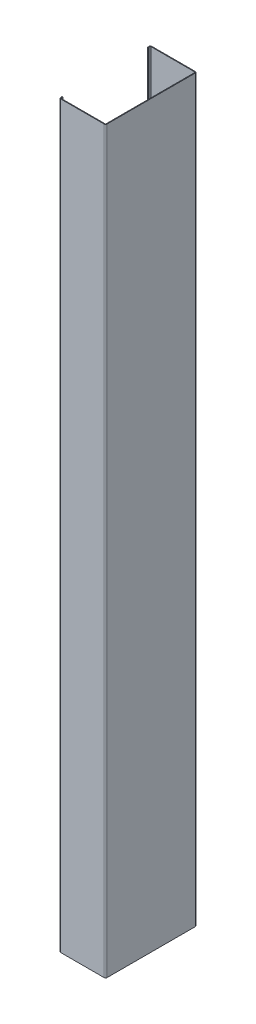
ISO-10303-21;
HEADER;
FILE_DESCRIPTION(('STEP AP214'),'2;1');
FILE_NAME('part.step','',(''),(''),'','','');
FILE_SCHEMA(('AUTOMOTIVE_DESIGN { 1 0 10303 214 1 1 1 1 }'));
ENDSEC;
DATA;
#1=APPLICATION_CONTEXT('core data for automotive mechanical design processes');
#2=APPLICATION_PROTOCOL_DEFINITION('international standard','automotive_design',2000,#1);
#3=PRODUCT_CONTEXT('',#1,'mechanical');
#4=PRODUCT('Part','Part','',(#3));
#5=PRODUCT_RELATED_PRODUCT_CATEGORY('part','',(#4));
#6=PRODUCT_DEFINITION_FORMATION('','',#4);
#7=PRODUCT_DEFINITION_CONTEXT('part definition',#1,'design');
#8=PRODUCT_DEFINITION('design','',#6,#7);
#9=PRODUCT_DEFINITION_SHAPE('','',#8);
#10=(LENGTH_UNIT() NAMED_UNIT(*) SI_UNIT(.MILLI.,.METRE.));
#11=(NAMED_UNIT(*) PLANE_ANGLE_UNIT() SI_UNIT($,.RADIAN.));
#12=(NAMED_UNIT(*) SI_UNIT($,.STERADIAN.) SOLID_ANGLE_UNIT());
#13=UNCERTAINTY_MEASURE_WITH_UNIT(LENGTH_MEASURE(1.E-05),#10,'distance_accuracy_value','');
#14=(GEOMETRIC_REPRESENTATION_CONTEXT(3) GLOBAL_UNCERTAINTY_ASSIGNED_CONTEXT((#13)) GLOBAL_UNIT_ASSIGNED_CONTEXT((#10,
#11,#12)) REPRESENTATION_CONTEXT('',''));
#15=CARTESIAN_POINT('',(0.,0.,0.));
#16=DIRECTION('',(0.,0.,1.));
#17=DIRECTION('',(1.,0.,0.));
#18=AXIS2_PLACEMENT_3D('',#15,#16,#17);
#19=CARTESIAN_POINT('',(-50.,3000.,-49.25));
#20=DIRECTION('',(1.,0.,0.));
#21=DIRECTION('',(0.,0.,-1.));
#22=AXIS2_PLACEMENT_3D('',#19,#20,#21);
#23=PLANE('',#22);
#24=DIRECTION('',(0.,0.,1.));
#25=VECTOR('',#24,1.);
#26=CARTESIAN_POINT('',(-50.,2200.75,-49.25));
#27=LINE('',#26,#25);
#28=CARTESIAN_POINT('',(-50.,2200.75,-47.75));
#29=VERTEX_POINT('',#28);
#30=CARTESIAN_POINT('',(-50.,2200.75,-46.25));
#31=VERTEX_POINT('',#30);
#32=EDGE_CURVE('E51',#29,#31,#27,.T.);
#33=ORIENTED_EDGE('',*,*,#32,.T.);
#34=DIRECTION('',(0.,-1.,0.));
#35=VECTOR('',#34,1.);
#36=CARTESIAN_POINT('',(-50.,3000.,-46.25));
#37=LINE('',#36,#35);
#38=CARTESIAN_POINT('',(-50.,3000.,-46.25));
#39=VERTEX_POINT('',#38);
#40=EDGE_CURVE('E45',#39,#31,#37,.T.);
#41=ORIENTED_EDGE('',*,*,#40,.F.);
#42=DIRECTION('',(0.,0.,1.));
#43=VECTOR('',#42,1.);
#44=CARTESIAN_POINT('',(-50.,3000.,-49.25));
#45=LINE('',#44,#43);
#46=CARTESIAN_POINT('',(-50.,3000.,-47.75));
#47=VERTEX_POINT('',#46);
#48=EDGE_CURVE('E178',#47,#39,#45,.T.);
#49=ORIENTED_EDGE('',*,*,#48,.F.);
#50=DIRECTION('',(0.,-1.,0.));
#51=VECTOR('',#50,1.);
#52=CARTESIAN_POINT('',(-50.,3000.,-47.75));
#53=LINE('',#52,#51);
#54=EDGE_CURVE('E185',#47,#29,#53,.T.);
#55=ORIENTED_EDGE('',*,*,#54,.T.);
#56=EDGE_LOOP('',(#33,#41,#49,#55));
#57=FACE_BOUND('',#56,.T.);
#58=ADVANCED_FACE('F38',(#57),#23,.F.);
#59=CARTESIAN_POINT('',(-49.25,3000.,-46.25));
#60=DIRECTION('',(0.,0.,1.));
#61=DIRECTION('',(1.,0.,0.));
#62=AXIS2_PLACEMENT_3D('',#59,#60,#61);
#63=PLANE('',#62);
#64=ORIENTED_EDGE('',*,*,#40,.T.);
#65=DIRECTION('',(1.,0.,0.));
#66=VECTOR('',#65,1.);
#67=CARTESIAN_POINT('',(-49.25,2200.75,-46.25));
#68=LINE('',#67,#66);
#69=CARTESIAN_POINT('',(-49.25,2200.75,-46.25));
#70=VERTEX_POINT('',#69);
#71=EDGE_CURVE('E171',#31,#70,#68,.T.);
#72=ORIENTED_EDGE('',*,*,#71,.T.);
#73=DIRECTION('',(0.,-1.,0.));
#74=VECTOR('',#73,1.);
#75=CARTESIAN_POINT('',(-49.25,3000.,-46.25));
#76=LINE('',#75,#74);
#77=CARTESIAN_POINT('',(-49.25,3000.,-46.25));
#78=VERTEX_POINT('',#77);
#79=EDGE_CURVE('E192',#78,#70,#76,.T.);
#80=ORIENTED_EDGE('',*,*,#79,.F.);
#81=DIRECTION('',(-1.,0.,0.));
#82=VECTOR('',#81,1.);
#83=CARTESIAN_POINT('',(-49.25,3000.,-46.25));
#84=LINE('',#83,#82);
#85=EDGE_CURVE('E191',#78,#39,#84,.T.);
#86=ORIENTED_EDGE('',*,*,#85,.T.);
#87=EDGE_LOOP('',(#64,#72,#80,#86));
#88=FACE_BOUND('',#87,.T.);
#89=ADVANCED_FACE('F189',(#88),#63,.T.);
#90=CARTESIAN_POINT('',(-49.25,3000.,-49.25));
#91=DIRECTION('',(1.,0.,0.));
#92=DIRECTION('',(0.,0.,-1.));
#93=AXIS2_PLACEMENT_3D('',#90,#91,#92);
#94=PLANE('',#93);
#95=ORIENTED_EDGE('',*,*,#79,.T.);
#96=DIRECTION('',(0.,0.,-1.));
#97=VECTOR('',#96,1.);
#98=CARTESIAN_POINT('',(-49.25,2200.75,-49.25));
#99=LINE('',#98,#97);
#100=CARTESIAN_POINT('',(-49.25,2200.75,-47.75));
#101=VERTEX_POINT('',#100);
#102=EDGE_CURVE('E174',#70,#101,#99,.T.);
#103=ORIENTED_EDGE('',*,*,#102,.T.);
#104=DIRECTION('',(0.,-1.,0.));
#105=VECTOR('',#104,1.);
#106=CARTESIAN_POINT('',(-49.25,3000.,-47.75));
#107=LINE('',#106,#105);
#108=CARTESIAN_POINT('',(-49.25,3000.,-47.75));
#109=VERTEX_POINT('',#108);
#110=EDGE_CURVE('E193',#109,#101,#107,.T.);
#111=ORIENTED_EDGE('',*,*,#110,.F.);
#112=DIRECTION('',(0.,0.,-1.));
#113=VECTOR('',#112,1.);
#114=CARTESIAN_POINT('',(-49.25,3000.,-49.25));
#115=LINE('',#114,#113);
#116=EDGE_CURVE('E289',#109,#78,#115,.F.);
#117=ORIENTED_EDGE('',*,*,#116,.T.);
#118=EDGE_LOOP('',(#95,#103,#111,#117));
#119=FACE_BOUND('',#118,.T.);
#120=ADVANCED_FACE('F397',(#119),#94,.T.);
#121=CARTESIAN_POINT('',(-48.5,3000.,-47.75));
#122=DIRECTION('',(0.,-1.,0.));
#123=DIRECTION('',(0.,0.,-1.));
#124=AXIS2_PLACEMENT_3D('',#121,#122,#123);
#125=CYLINDRICAL_SURFACE('',#124,0.75);
#126=ORIENTED_EDGE('',*,*,#110,.T.);
#127=CARTESIAN_POINT('',(-48.5,2200.75,-47.75));
#128=DIRECTION('',(0.,-1.,0.));
#129=DIRECTION('',(0.,0.,-1.));
#130=AXIS2_PLACEMENT_3D('',#127,#128,#129);
#131=CIRCLE('',#130,0.75);
#132=CARTESIAN_POINT('',(-48.5,2200.75,-48.5));
#133=VERTEX_POINT('',#132);
#134=EDGE_CURVE('E295',#101,#133,#131,.T.);
#135=ORIENTED_EDGE('',*,*,#134,.T.);
#136=DIRECTION('',(0.,-1.,0.));
#137=VECTOR('',#136,1.);
#138=CARTESIAN_POINT('',(-48.5,3000.,-48.5));
#139=LINE('',#138,#137);
#140=CARTESIAN_POINT('',(-48.5,3000.,-48.5));
#141=VERTEX_POINT('',#140);
#142=EDGE_CURVE('E198',#141,#133,#139,.T.);
#143=ORIENTED_EDGE('',*,*,#142,.F.);
#144=CARTESIAN_POINT('',(-48.5,3000.,-47.75));
#145=DIRECTION('',(0.,1.,0.));
#146=DIRECTION('',(1.,0.,0.));
#147=AXIS2_PLACEMENT_3D('',#144,#145,#146);
#148=CIRCLE('',#147,0.75);
#149=EDGE_CURVE('E286',#141,#109,#148,.T.);
#150=ORIENTED_EDGE('',*,*,#149,.T.);
#151=EDGE_LOOP('',(#126,#135,#143,#150));
#152=FACE_BOUND('',#151,.T.);
#153=ADVANCED_FACE('F395',(#152),#125,.F.);
#154=CARTESIAN_POINT('',(-50.,3000.,-48.5));
#155=DIRECTION('',(0.,0.,1.));
#156=DIRECTION('',(1.,0.,0.));
#157=AXIS2_PLACEMENT_3D('',#154,#155,#156);
#158=PLANE('',#157);
#159=ORIENTED_EDGE('',*,*,#142,.T.);
#160=DIRECTION('',(1.,0.,0.));
#161=VECTOR('',#160,1.);
#162=CARTESIAN_POINT('',(-50.,2200.75,-48.5));
#163=LINE('',#162,#161);
#164=CARTESIAN_POINT('',(-1.50000000000004,2200.75,-48.5));
#165=VERTEX_POINT('',#164);
#166=EDGE_CURVE('E298',#133,#165,#163,.T.);
#167=ORIENTED_EDGE('',*,*,#166,.T.);
#168=DIRECTION('',(0.,-1.,0.));
#169=VECTOR('',#168,1.);
#170=CARTESIAN_POINT('',(-1.50000000000004,3000.,-48.5));
#171=LINE('',#170,#169);
#172=CARTESIAN_POINT('',(-1.50000000000004,3000.,-48.5));
#173=VERTEX_POINT('',#172);
#174=EDGE_CURVE('E201',#173,#165,#171,.T.);
#175=ORIENTED_EDGE('',*,*,#174,.F.);
#176=DIRECTION('',(1.,0.,0.));
#177=VECTOR('',#176,1.);
#178=CARTESIAN_POINT('',(-50.,3000.,-48.5));
#179=LINE('',#178,#177);
#180=EDGE_CURVE('E283',#173,#141,#179,.F.);
#181=ORIENTED_EDGE('',*,*,#180,.T.);
#182=EDGE_LOOP('',(#159,#167,#175,#181));
#183=FACE_BOUND('',#182,.T.);
#184=ADVANCED_FACE('F391',(#183),#158,.T.);
#185=CARTESIAN_POINT('',(-1.50000000000004,3000.,-47.75));
#186=DIRECTION('',(0.,-1.,0.));
#187=DIRECTION('',(0.,0.,-1.));
#188=AXIS2_PLACEMENT_3D('',#185,#186,#187);
#189=CYLINDRICAL_SURFACE('',#188,0.75);
#190=ORIENTED_EDGE('',*,*,#174,.T.);
#191=CARTESIAN_POINT('',(-1.50000000000004,2200.75,-47.75));
#192=DIRECTION('',(0.,-1.,0.));
#193=DIRECTION('',(0.,0.,-1.));
#194=AXIS2_PLACEMENT_3D('',#191,#192,#193);
#195=CIRCLE('',#194,0.75);
#196=CARTESIAN_POINT('',(-0.750000000000037,2200.75,-47.75));
#197=VERTEX_POINT('',#196);
#198=EDGE_CURVE('E301',#165,#197,#195,.T.);
#199=ORIENTED_EDGE('',*,*,#198,.T.);
#200=DIRECTION('',(0.,-1.,0.));
#201=VECTOR('',#200,1.);
#202=CARTESIAN_POINT('',(-0.750000000000037,3000.,-47.75));
#203=LINE('',#202,#201);
#204=CARTESIAN_POINT('',(-0.750000000000037,3000.,-47.75));
#205=VERTEX_POINT('',#204);
#206=EDGE_CURVE('E204',#205,#197,#203,.T.);
#207=ORIENTED_EDGE('',*,*,#206,.F.);
#208=CARTESIAN_POINT('',(-1.50000000000004,3000.,-47.75));
#209=DIRECTION('',(0.,1.,0.));
#210=DIRECTION('',(1.,0.,0.));
#211=AXIS2_PLACEMENT_3D('',#208,#209,#210);
#212=CIRCLE('',#211,0.75);
#213=EDGE_CURVE('E280',#205,#173,#212,.T.);
#214=ORIENTED_EDGE('',*,*,#213,.T.);
#215=EDGE_LOOP('',(#190,#199,#207,#214));
#216=FACE_BOUND('',#215,.T.);
#217=ADVANCED_FACE('F389',(#216),#189,.F.);
#218=CARTESIAN_POINT('',(-0.750000000000038,3000.,-49.25));
#219=DIRECTION('',(-1.,0.,0.));
#220=DIRECTION('',(0.,0.,1.));
#221=AXIS2_PLACEMENT_3D('',#218,#219,#220);
#222=PLANE('',#221);
#223=ORIENTED_EDGE('',*,*,#206,.T.);
#224=DIRECTION('',(0.,0.,1.));
#225=VECTOR('',#224,1.);
#226=CARTESIAN_POINT('',(-0.750000000000038,2200.75,-49.25));
#227=LINE('',#226,#225);
#228=CARTESIAN_POINT('',(-0.749999999999984,2200.75,47.75));
#229=VERTEX_POINT('',#228);
#230=EDGE_CURVE('E304',#197,#229,#227,.T.);
#231=ORIENTED_EDGE('',*,*,#230,.T.);
#232=DIRECTION('',(0.,-1.,0.));
#233=VECTOR('',#232,1.);
#234=CARTESIAN_POINT('',(-0.749999999999984,3000.,47.75));
#235=LINE('',#234,#233);
#236=CARTESIAN_POINT('',(-0.749999999999984,3000.,47.75));
#237=VERTEX_POINT('',#236);
#238=EDGE_CURVE('E207',#237,#229,#235,.T.);
#239=ORIENTED_EDGE('',*,*,#238,.F.);
#240=DIRECTION('',(0.,0.,-1.));
#241=VECTOR('',#240,1.);
#242=CARTESIAN_POINT('',(-0.750000000000038,3000.,-49.25));
#243=LINE('',#242,#241);
#244=EDGE_CURVE('E277',#237,#205,#243,.T.);
#245=ORIENTED_EDGE('',*,*,#244,.T.);
#246=EDGE_LOOP('',(#223,#231,#239,#245));
#247=FACE_BOUND('',#246,.T.);
#248=ADVANCED_FACE('F387',(#247),#222,.T.);
#249=CARTESIAN_POINT('',(-1.49999999999998,3000.,47.75));
#250=DIRECTION('',(0.,-1.,0.));
#251=DIRECTION('',(0.,0.,-1.));
#252=AXIS2_PLACEMENT_3D('',#249,#250,#251);
#253=CYLINDRICAL_SURFACE('',#252,0.75);
#254=ORIENTED_EDGE('',*,*,#238,.T.);
#255=CARTESIAN_POINT('',(-1.49999999999998,2200.75,47.75));
#256=DIRECTION('',(0.,-1.,0.));
#257=DIRECTION('',(0.,0.,-1.));
#258=AXIS2_PLACEMENT_3D('',#255,#256,#257);
#259=CIRCLE('',#258,0.75);
#260=CARTESIAN_POINT('',(-1.49999999999998,2200.75,48.5));
#261=VERTEX_POINT('',#260);
#262=EDGE_CURVE('E307',#229,#261,#259,.T.);
#263=ORIENTED_EDGE('',*,*,#262,.T.);
#264=DIRECTION('',(0.,-1.,0.));
#265=VECTOR('',#264,1.);
#266=CARTESIAN_POINT('',(-1.49999999999998,3000.,48.5));
#267=LINE('',#266,#265);
#268=CARTESIAN_POINT('',(-1.49999999999998,3000.,48.5));
#269=VERTEX_POINT('',#268);
#270=EDGE_CURVE('E210',#269,#261,#267,.T.);
#271=ORIENTED_EDGE('',*,*,#270,.F.);
#272=CARTESIAN_POINT('',(-1.49999999999998,3000.,47.75));
#273=DIRECTION('',(0.,1.,0.));
#274=DIRECTION('',(1.,0.,0.));
#275=AXIS2_PLACEMENT_3D('',#272,#273,#274);
#276=CIRCLE('',#275,0.75);
#277=EDGE_CURVE('E274',#269,#237,#276,.T.);
#278=ORIENTED_EDGE('',*,*,#277,.T.);
#279=EDGE_LOOP('',(#254,#263,#271,#278));
#280=FACE_BOUND('',#279,.T.);
#281=ADVANCED_FACE('F382',(#280),#253,.F.);
#282=CARTESIAN_POINT('',(0.,3000.,48.5));
#283=DIRECTION('',(0.,0.,-1.));
#284=DIRECTION('',(-1.,0.,0.));
#285=AXIS2_PLACEMENT_3D('',#282,#283,#284);
#286=PLANE('',#285);
#287=ORIENTED_EDGE('',*,*,#270,.T.);
#288=DIRECTION('',(-1.,0.,0.));
#289=VECTOR('',#288,1.);
#290=CARTESIAN_POINT('',(0.,2200.75,48.5));
#291=LINE('',#290,#289);
#292=CARTESIAN_POINT('',(-48.5,2200.75,48.5));
#293=VERTEX_POINT('',#292);
#294=EDGE_CURVE('E310',#261,#293,#291,.T.);
#295=ORIENTED_EDGE('',*,*,#294,.T.);
#296=DIRECTION('',(0.,-1.,0.));
#297=VECTOR('',#296,1.);
#298=CARTESIAN_POINT('',(-48.5,3000.,48.5));
#299=LINE('',#298,#297);
#300=CARTESIAN_POINT('',(-48.5,3000.,48.5));
#301=VERTEX_POINT('',#300);
#302=EDGE_CURVE('E213',#301,#293,#299,.T.);
#303=ORIENTED_EDGE('',*,*,#302,.F.);
#304=DIRECTION('',(1.,0.,0.));
#305=VECTOR('',#304,1.);
#306=CARTESIAN_POINT('',(0.,3000.,48.5));
#307=LINE('',#306,#305);
#308=EDGE_CURVE('E271',#301,#269,#307,.T.);
#309=ORIENTED_EDGE('',*,*,#308,.T.);
#310=EDGE_LOOP('',(#287,#295,#303,#309));
#311=FACE_BOUND('',#310,.T.);
#312=ADVANCED_FACE('F380',(#311),#286,.T.);
#313=CARTESIAN_POINT('',(-48.5,3000.,47.75));
#314=DIRECTION('',(0.,-1.,0.));
#315=DIRECTION('',(0.,0.,-1.));
#316=AXIS2_PLACEMENT_3D('',#313,#314,#315);
#317=CYLINDRICAL_SURFACE('',#316,0.75);
#318=ORIENTED_EDGE('',*,*,#302,.T.);
#319=CARTESIAN_POINT('',(-48.5,2200.75,47.75));
#320=DIRECTION('',(0.,-1.,0.));
#321=DIRECTION('',(0.,0.,-1.));
#322=AXIS2_PLACEMENT_3D('',#319,#320,#321);
#323=CIRCLE('',#322,0.75);
#324=CARTESIAN_POINT('',(-49.25,2200.75,47.75));
#325=VERTEX_POINT('',#324);
#326=EDGE_CURVE('E313',#293,#325,#323,.T.);
#327=ORIENTED_EDGE('',*,*,#326,.T.);
#328=DIRECTION('',(0.,-1.,0.));
#329=VECTOR('',#328,1.);
#330=CARTESIAN_POINT('',(-49.25,3000.,47.75));
#331=LINE('',#330,#329);
#332=CARTESIAN_POINT('',(-49.25,3000.,47.75));
#333=VERTEX_POINT('',#332);
#334=EDGE_CURVE('E216',#333,#325,#331,.T.);
#335=ORIENTED_EDGE('',*,*,#334,.F.);
#336=CARTESIAN_POINT('',(-48.5,3000.,47.75));
#337=DIRECTION('',(0.,1.,0.));
#338=DIRECTION('',(1.,0.,0.));
#339=AXIS2_PLACEMENT_3D('',#336,#337,#338);
#340=CIRCLE('',#339,0.75);
#341=EDGE_CURVE('E268',#333,#301,#340,.T.);
#342=ORIENTED_EDGE('',*,*,#341,.T.);
#343=EDGE_LOOP('',(#318,#327,#335,#342));
#344=FACE_BOUND('',#343,.T.);
#345=ADVANCED_FACE('F378',(#344),#317,.F.);
#346=CARTESIAN_POINT('',(-49.25,3000.,49.25));
#347=DIRECTION('',(1.,0.,0.));
#348=DIRECTION('',(0.,0.,-1.));
#349=AXIS2_PLACEMENT_3D('',#346,#347,#348);
#350=PLANE('',#349);
#351=ORIENTED_EDGE('',*,*,#334,.T.);
#352=DIRECTION('',(0.,0.,-1.));
#353=VECTOR('',#352,1.);
#354=CARTESIAN_POINT('',(-49.25,2200.75,49.25));
#355=LINE('',#354,#353);
#356=CARTESIAN_POINT('',(-49.25,2200.75,46.25));
#357=VERTEX_POINT('',#356);
#358=EDGE_CURVE('E316',#325,#357,#355,.T.);
#359=ORIENTED_EDGE('',*,*,#358,.T.);
#360=DIRECTION('',(0.,-1.,0.));
#361=VECTOR('',#360,1.);
#362=CARTESIAN_POINT('',(-49.25,3000.,46.25));
#363=LINE('',#362,#361);
#364=CARTESIAN_POINT('',(-49.25,3000.,46.25));
#365=VERTEX_POINT('',#364);
#366=EDGE_CURVE('E219',#365,#357,#363,.T.);
#367=ORIENTED_EDGE('',*,*,#366,.F.);
#368=DIRECTION('',(0.,0.,-1.));
#369=VECTOR('',#368,1.);
#370=CARTESIAN_POINT('',(-49.25,3000.,49.25));
#371=LINE('',#370,#369);
#372=EDGE_CURVE('E265',#365,#333,#371,.F.);
#373=ORIENTED_EDGE('',*,*,#372,.T.);
#374=EDGE_LOOP('',(#351,#359,#367,#373));
#375=FACE_BOUND('',#374,.T.);
#376=ADVANCED_FACE('F373',(#375),#350,.T.);
#377=CARTESIAN_POINT('',(-50.,3000.,46.25));
#378=DIRECTION('',(0.,0.,-1.));
#379=DIRECTION('',(-1.,0.,0.));
#380=AXIS2_PLACEMENT_3D('',#377,#378,#379);
#381=PLANE('',#380);
#382=ORIENTED_EDGE('',*,*,#366,.T.);
#383=DIRECTION('',(-1.,0.,0.));
#384=VECTOR('',#383,1.);
#385=CARTESIAN_POINT('',(-50.,2200.75,46.25));
#386=LINE('',#385,#384);
#387=CARTESIAN_POINT('',(-50.,2200.75,46.25));
#388=VERTEX_POINT('',#387);
#389=EDGE_CURVE('E319',#357,#388,#386,.T.);
#390=ORIENTED_EDGE('',*,*,#389,.T.);
#391=DIRECTION('',(0.,-1.,0.));
#392=VECTOR('',#391,1.);
#393=CARTESIAN_POINT('',(-50.,3000.,46.25));
#394=LINE('',#393,#392);
#395=CARTESIAN_POINT('',(-50.,3000.,46.25));
#396=VERTEX_POINT('',#395);
#397=EDGE_CURVE('E222',#396,#388,#394,.T.);
#398=ORIENTED_EDGE('',*,*,#397,.F.);
#399=DIRECTION('',(1.,0.,0.));
#400=VECTOR('',#399,1.);
#401=CARTESIAN_POINT('',(-50.,3000.,46.25));
#402=LINE('',#401,#400);
#403=EDGE_CURVE('E262',#396,#365,#402,.T.);
#404=ORIENTED_EDGE('',*,*,#403,.T.);
#405=EDGE_LOOP('',(#382,#390,#398,#404));
#406=FACE_BOUND('',#405,.T.);
#407=ADVANCED_FACE('F370',(#406),#381,.T.);
#408=CARTESIAN_POINT('',(-50.,3000.,49.25));
#409=DIRECTION('',(1.,0.,0.));
#410=DIRECTION('',(0.,0.,-1.));
#411=AXIS2_PLACEMENT_3D('',#408,#409,#410);
#412=PLANE('',#411);
#413=CARTESIAN_POINT('',(-50.,2200.75,47.75));
#414=VERTEX_POINT('',#413);
#415=EDGE_CURVE('E187',#388,#414,#27,.T.);
#416=ORIENTED_EDGE('',*,*,#415,.T.);
#417=DIRECTION('',(0.,-1.,0.));
#418=VECTOR('',#417,1.);
#419=CARTESIAN_POINT('',(-50.,3000.,47.75));
#420=LINE('',#419,#418);
#421=CARTESIAN_POINT('',(-50.,3000.,47.75));
#422=VERTEX_POINT('',#421);
#423=EDGE_CURVE('E225',#422,#414,#420,.T.);
#424=ORIENTED_EDGE('',*,*,#423,.F.);
#425=DIRECTION('',(0.,0.,1.));
#426=VECTOR('',#425,1.);
#427=CARTESIAN_POINT('',(-50.,3000.,49.25));
#428=LINE('',#427,#426);
#429=EDGE_CURVE('E260',#396,#422,#428,.T.);
#430=ORIENTED_EDGE('',*,*,#429,.F.);
#431=ORIENTED_EDGE('',*,*,#397,.T.);
#432=EDGE_LOOP('',(#416,#424,#430,#431));
#433=FACE_BOUND('',#432,.T.);
#434=ADVANCED_FACE('F367',(#433),#412,.F.);
#435=CARTESIAN_POINT('',(-48.5,3000.,47.75));
#436=DIRECTION('',(0.,-1.,0.));
#437=DIRECTION('',(0.,0.,-1.));
#438=AXIS2_PLACEMENT_3D('',#435,#436,#437);
#439=CYLINDRICAL_SURFACE('',#438,1.5);
#440=CARTESIAN_POINT('',(-48.5,2200.75,47.75));
#441=DIRECTION('',(0.,-1.,0.));
#442=DIRECTION('',(0.,0.,-1.));
#443=AXIS2_PLACEMENT_3D('',#440,#441,#442);
#444=CIRCLE('',#443,1.5);
#445=CARTESIAN_POINT('',(-48.5,2200.75,49.25));
#446=VERTEX_POINT('',#445);
#447=EDGE_CURVE('E322',#446,#414,#444,.T.);
#448=ORIENTED_EDGE('',*,*,#447,.F.);
#449=DIRECTION('',(0.,-1.,0.));
#450=VECTOR('',#449,1.);
#451=CARTESIAN_POINT('',(-48.5,3000.,49.25));
#452=LINE('',#451,#450);
#453=CARTESIAN_POINT('',(-48.5,3000.,49.25));
#454=VERTEX_POINT('',#453);
#455=EDGE_CURVE('E228',#454,#446,#452,.T.);
#456=ORIENTED_EDGE('',*,*,#455,.F.);
#457=CARTESIAN_POINT('',(-48.5,3000.,47.75));
#458=DIRECTION('',(0.,-1.,0.));
#459=DIRECTION('',(0.,0.,-1.));
#460=AXIS2_PLACEMENT_3D('',#457,#458,#459);
#461=CIRCLE('',#460,1.5);
#462=EDGE_CURVE('E258',#422,#454,#461,.F.);
#463=ORIENTED_EDGE('',*,*,#462,.F.);
#464=ORIENTED_EDGE('',*,*,#423,.T.);
#465=EDGE_LOOP('',(#448,#456,#463,#464));
#466=FACE_BOUND('',#465,.T.);
#467=ADVANCED_FACE('F362',(#466),#439,.T.);
#468=CARTESIAN_POINT('',(0.,3000.,49.25));
#469=DIRECTION('',(0.,0.,-1.));
#470=DIRECTION('',(-1.,0.,0.));
#471=AXIS2_PLACEMENT_3D('',#468,#469,#470);
#472=PLANE('',#471);
#473=DIRECTION('',(1.,0.,0.));
#474=VECTOR('',#473,1.);
#475=CARTESIAN_POINT('',(1.25219137403247E-13,2200.75,49.25));
#476=LINE('',#475,#474);
#477=CARTESIAN_POINT('',(-1.49999999999998,2200.75,49.25));
#478=VERTEX_POINT('',#477);
#479=EDGE_CURVE('E331',#446,#478,#476,.T.);
#480=ORIENTED_EDGE('',*,*,#479,.T.);
#481=DIRECTION('',(0.,-1.,0.));
#482=VECTOR('',#481,1.);
#483=CARTESIAN_POINT('',(-1.49999999999998,3000.,49.25));
#484=LINE('',#483,#482);
#485=CARTESIAN_POINT('',(-1.49999999999998,3000.,49.25));
#486=VERTEX_POINT('',#485);
#487=EDGE_CURVE('E231',#486,#478,#484,.T.);
#488=ORIENTED_EDGE('',*,*,#487,.F.);
#489=DIRECTION('',(1.,0.,0.));
#490=VECTOR('',#489,1.);
#491=CARTESIAN_POINT('',(0.,3000.,49.25));
#492=LINE('',#491,#490);
#493=EDGE_CURVE('E256',#454,#486,#492,.T.);
#494=ORIENTED_EDGE('',*,*,#493,.F.);
#495=ORIENTED_EDGE('',*,*,#455,.T.);
#496=EDGE_LOOP('',(#480,#488,#494,#495));
#497=FACE_BOUND('',#496,.T.);
#498=ADVANCED_FACE('F358',(#497),#472,.F.);
#499=CARTESIAN_POINT('',(-1.49999999999998,3000.,47.75));
#500=DIRECTION('',(0.,-1.,0.));
#501=DIRECTION('',(0.,0.,-1.));
#502=AXIS2_PLACEMENT_3D('',#499,#500,#501);
#503=CYLINDRICAL_SURFACE('',#502,1.5);
#504=CARTESIAN_POINT('',(-1.49999999999998,2200.75,47.75));
#505=DIRECTION('',(0.,-1.,0.));
#506=DIRECTION('',(0.,0.,-1.));
#507=AXIS2_PLACEMENT_3D('',#504,#505,#506);
#508=CIRCLE('',#507,1.5);
#509=CARTESIAN_POINT('',(1.25219137403247E-13,2200.75,47.75));
#510=VERTEX_POINT('',#509);
#511=EDGE_CURVE('E324',#510,#478,#508,.T.);
#512=ORIENTED_EDGE('',*,*,#511,.F.);
#513=DIRECTION('',(0.,-1.,0.));
#514=VECTOR('',#513,1.);
#515=CARTESIAN_POINT('',(0.,3000.,47.75));
#516=LINE('',#515,#514);
#517=CARTESIAN_POINT('',(0.,3000.,47.75));
#518=VERTEX_POINT('',#517);
#519=EDGE_CURVE('E234',#518,#510,#516,.T.);
#520=ORIENTED_EDGE('',*,*,#519,.F.);
#521=CARTESIAN_POINT('',(-1.49999999999998,3000.,47.75));
#522=DIRECTION('',(0.,-1.,0.));
#523=DIRECTION('',(0.,0.,-1.));
#524=AXIS2_PLACEMENT_3D('',#521,#522,#523);
#525=CIRCLE('',#524,1.5);
#526=EDGE_CURVE('E254',#486,#518,#525,.F.);
#527=ORIENTED_EDGE('',*,*,#526,.F.);
#528=ORIENTED_EDGE('',*,*,#487,.T.);
#529=EDGE_LOOP('',(#512,#520,#527,#528));
#530=FACE_BOUND('',#529,.T.);
#531=ADVANCED_FACE('F354',(#530),#503,.T.);
#532=CARTESIAN_POINT('',(0.,3000.,-49.25));
#533=DIRECTION('',(-1.,0.,0.));
#534=DIRECTION('',(0.,0.,1.));
#535=AXIS2_PLACEMENT_3D('',#532,#533,#534);
#536=PLANE('',#535);
#537=DIRECTION('',(0.,0.,1.));
#538=VECTOR('',#537,1.);
#539=CARTESIAN_POINT('',(1.25219137403247E-13,2200.75,-49.25));
#540=LINE('',#539,#538);
#541=CARTESIAN_POINT('',(1.24683249835833E-13,2200.75,-47.75));
#542=VERTEX_POINT('',#541);
#543=EDGE_CURVE('E186',#542,#510,#540,.T.);
#544=ORIENTED_EDGE('',*,*,#543,.F.);
#545=DIRECTION('',(0.,-1.,0.));
#546=VECTOR('',#545,1.);
#547=CARTESIAN_POINT('',(0.,3000.,-47.75));
#548=LINE('',#547,#546);
#549=CARTESIAN_POINT('',(0.,3000.,-47.75));
#550=VERTEX_POINT('',#549);
#551=EDGE_CURVE('E237',#550,#542,#548,.T.);
#552=ORIENTED_EDGE('',*,*,#551,.F.);
#553=DIRECTION('',(0.,0.,-1.));
#554=VECTOR('',#553,1.);
#555=CARTESIAN_POINT('',(0.,3000.,-49.25));
#556=LINE('',#555,#554);
#557=EDGE_CURVE('E252',#518,#550,#556,.T.);
#558=ORIENTED_EDGE('',*,*,#557,.F.);
#559=ORIENTED_EDGE('',*,*,#519,.T.);
#560=EDGE_LOOP('',(#544,#552,#558,#559));
#561=FACE_BOUND('',#560,.T.);
#562=ADVANCED_FACE('F351',(#561),#536,.F.);
#563=CARTESIAN_POINT('',(-1.50000000000004,3000.,-47.75));
#564=DIRECTION('',(0.,-1.,0.));
#565=DIRECTION('',(0.,0.,-1.));
#566=AXIS2_PLACEMENT_3D('',#563,#564,#565);
#567=CYLINDRICAL_SURFACE('',#566,1.5);
#568=CARTESIAN_POINT('',(-1.50000000000004,2200.75,-47.75));
#569=DIRECTION('',(0.,-1.,0.));
#570=DIRECTION('',(0.,0.,-1.));
#571=AXIS2_PLACEMENT_3D('',#568,#569,#570);
#572=CIRCLE('',#571,1.5);
#573=CARTESIAN_POINT('',(-1.50000000000004,2200.75,-49.25));
#574=VERTEX_POINT('',#573);
#575=EDGE_CURVE('E326',#574,#542,#572,.T.);
#576=ORIENTED_EDGE('',*,*,#575,.F.);
#577=DIRECTION('',(0.,-1.,0.));
#578=VECTOR('',#577,1.);
#579=CARTESIAN_POINT('',(-1.50000000000004,3000.,-49.25));
#580=LINE('',#579,#578);
#581=CARTESIAN_POINT('',(-1.50000000000004,3000.,-49.25));
#582=VERTEX_POINT('',#581);
#583=EDGE_CURVE('E240',#582,#574,#580,.T.);
#584=ORIENTED_EDGE('',*,*,#583,.F.);
#585=CARTESIAN_POINT('',(-1.50000000000004,3000.,-47.75));
#586=DIRECTION('',(0.,-1.,0.));
#587=DIRECTION('',(0.,0.,-1.));
#588=AXIS2_PLACEMENT_3D('',#585,#586,#587);
#589=CIRCLE('',#588,1.5);
#590=EDGE_CURVE('E250',#550,#582,#589,.F.);
#591=ORIENTED_EDGE('',*,*,#590,.F.);
#592=ORIENTED_EDGE('',*,*,#551,.T.);
#593=EDGE_LOOP('',(#576,#584,#591,#592));
#594=FACE_BOUND('',#593,.T.);
#595=ADVANCED_FACE('F341',(#594),#567,.T.);
#596=CARTESIAN_POINT('',(-50.,3000.,-49.25));
#597=DIRECTION('',(0.,0.,1.));
#598=DIRECTION('',(1.,0.,0.));
#599=AXIS2_PLACEMENT_3D('',#596,#597,#598);
#600=PLANE('',#599);
#601=DIRECTION('',(1.,0.,0.));
#602=VECTOR('',#601,1.);
#603=CARTESIAN_POINT('',(1.25219137403247E-13,2200.75,-49.25));
#604=LINE('',#603,#602);
#605=CARTESIAN_POINT('',(-48.5,2200.75,-49.25));
#606=VERTEX_POINT('',#605);
#607=EDGE_CURVE('E329',#606,#574,#604,.T.);
#608=ORIENTED_EDGE('',*,*,#607,.F.);
#609=DIRECTION('',(0.,-1.,0.));
#610=VECTOR('',#609,1.);
#611=CARTESIAN_POINT('',(-48.5,3000.,-49.25));
#612=LINE('',#611,#610);
#613=CARTESIAN_POINT('',(-48.5,3000.,-49.25));
#614=VERTEX_POINT('',#613);
#615=EDGE_CURVE('E243',#614,#606,#612,.T.);
#616=ORIENTED_EDGE('',*,*,#615,.F.);
#617=DIRECTION('',(-1.,0.,0.));
#618=VECTOR('',#617,1.);
#619=CARTESIAN_POINT('',(-50.,3000.,-49.25));
#620=LINE('',#619,#618);
#621=EDGE_CURVE('E248',#582,#614,#620,.T.);
#622=ORIENTED_EDGE('',*,*,#621,.F.);
#623=ORIENTED_EDGE('',*,*,#583,.T.);
#624=EDGE_LOOP('',(#608,#616,#622,#623));
#625=FACE_BOUND('',#624,.T.);
#626=ADVANCED_FACE('F345',(#625),#600,.F.);
#627=CARTESIAN_POINT('',(-48.5,3000.,-47.75));
#628=DIRECTION('',(0.,-1.,0.));
#629=DIRECTION('',(0.,0.,-1.));
#630=AXIS2_PLACEMENT_3D('',#627,#628,#629);
#631=CYLINDRICAL_SURFACE('',#630,1.5);
#632=CARTESIAN_POINT('',(-48.5,2200.75,-47.75));
#633=DIRECTION('',(0.,-1.,0.));
#634=DIRECTION('',(0.,0.,-1.));
#635=AXIS2_PLACEMENT_3D('',#632,#633,#634);
#636=CIRCLE('',#635,1.5);
#637=EDGE_CURVE('E12',#29,#606,#636,.T.);
#638=ORIENTED_EDGE('',*,*,#637,.F.);
#639=ORIENTED_EDGE('',*,*,#54,.F.);
#640=CARTESIAN_POINT('',(-48.5,3000.,-47.75));
#641=DIRECTION('',(0.,-1.,0.));
#642=DIRECTION('',(0.,0.,-1.));
#643=AXIS2_PLACEMENT_3D('',#640,#641,#642);
#644=CIRCLE('',#643,1.5);
#645=EDGE_CURVE('E59',#614,#47,#644,.F.);
#646=ORIENTED_EDGE('',*,*,#645,.F.);
#647=ORIENTED_EDGE('',*,*,#615,.T.);
#648=EDGE_LOOP('',(#638,#639,#646,#647));
#649=FACE_BOUND('',#648,.T.);
#650=ADVANCED_FACE('F543',(#649),#631,.T.);
#651=CARTESIAN_POINT('',(-48.5,3000.,-47.75));
#652=DIRECTION('',(0.,1.,0.));
#653=DIRECTION('',(1.,0.,0.));
#654=AXIS2_PLACEMENT_3D('',#651,#652,#653);
#655=PLANE('',#654);
#656=ORIENTED_EDGE('',*,*,#48,.T.);
#657=ORIENTED_EDGE('',*,*,#85,.F.);
#658=ORIENTED_EDGE('',*,*,#116,.F.);
#659=ORIENTED_EDGE('',*,*,#149,.F.);
#660=ORIENTED_EDGE('',*,*,#180,.F.);
#661=ORIENTED_EDGE('',*,*,#213,.F.);
#662=ORIENTED_EDGE('',*,*,#244,.F.);
#663=ORIENTED_EDGE('',*,*,#277,.F.);
#664=ORIENTED_EDGE('',*,*,#308,.F.);
#665=ORIENTED_EDGE('',*,*,#341,.F.);
#666=ORIENTED_EDGE('',*,*,#372,.F.);
#667=ORIENTED_EDGE('',*,*,#403,.F.);
#668=ORIENTED_EDGE('',*,*,#429,.T.);
#669=ORIENTED_EDGE('',*,*,#462,.T.);
#670=ORIENTED_EDGE('',*,*,#493,.T.);
#671=ORIENTED_EDGE('',*,*,#526,.T.);
#672=ORIENTED_EDGE('',*,*,#557,.T.);
#673=ORIENTED_EDGE('',*,*,#590,.T.);
#674=ORIENTED_EDGE('',*,*,#621,.T.);
#675=ORIENTED_EDGE('',*,*,#645,.T.);
#676=EDGE_LOOP('',(#656,#657,#658,#659,#660,#661,#662,#663,#664,#665,#666,#667,#668,#669,#670,
#671,#672,#673,#674,#675));
#677=FACE_BOUND('',#676,.T.);
#678=ADVANCED_FACE('F346',(#677),#655,.T.);
#679=CARTESIAN_POINT('',(1.25219137403247E-13,2200.75,-49.25));
#680=DIRECTION('',(0.,-1.,0.));
#681=DIRECTION('',(0.,0.,-1.));
#682=AXIS2_PLACEMENT_3D('',#679,#680,#681);
#683=PLANE('',#682);
#684=ORIENTED_EDGE('',*,*,#32,.F.);
#685=ORIENTED_EDGE('',*,*,#637,.T.);
#686=ORIENTED_EDGE('',*,*,#607,.T.);
#687=ORIENTED_EDGE('',*,*,#575,.T.);
#688=ORIENTED_EDGE('',*,*,#543,.T.);
#689=ORIENTED_EDGE('',*,*,#511,.T.);
#690=ORIENTED_EDGE('',*,*,#479,.F.);
#691=ORIENTED_EDGE('',*,*,#447,.T.);
#692=ORIENTED_EDGE('',*,*,#415,.F.);
#693=ORIENTED_EDGE('',*,*,#389,.F.);
#694=ORIENTED_EDGE('',*,*,#358,.F.);
#695=ORIENTED_EDGE('',*,*,#326,.F.);
#696=ORIENTED_EDGE('',*,*,#294,.F.);
#697=ORIENTED_EDGE('',*,*,#262,.F.);
#698=ORIENTED_EDGE('',*,*,#230,.F.);
#699=ORIENTED_EDGE('',*,*,#198,.F.);
#700=ORIENTED_EDGE('',*,*,#166,.F.);
#701=ORIENTED_EDGE('',*,*,#134,.F.);
#702=ORIENTED_EDGE('',*,*,#102,.F.);
#703=ORIENTED_EDGE('',*,*,#71,.F.);
#704=EDGE_LOOP('',(#684,#685,#686,#687,#688,#689,#690,#691,#692,#693,#694,#695,#696,#697,#698,
#699,#700,#701,#702,#703));
#705=FACE_BOUND('',#704,.T.);
#706=ADVANCED_FACE('F172',(#705),#683,.T.);
#707=CLOSED_SHELL('',(#58,#89,#120,#153,#184,#217,#248,#281,#312,#345,#376,#407,#434,#467,#498,
#531,#562,#595,#626,#650,#678,#706));
#708=MANIFOLD_SOLID_BREP('B2',#707);
#709=ADVANCED_BREP_SHAPE_REPRESENTATION('',(#18,#708),#14);
#710=SHAPE_DEFINITION_REPRESENTATION(#9,#709);
ENDSEC;
END-ISO-10303-21;
